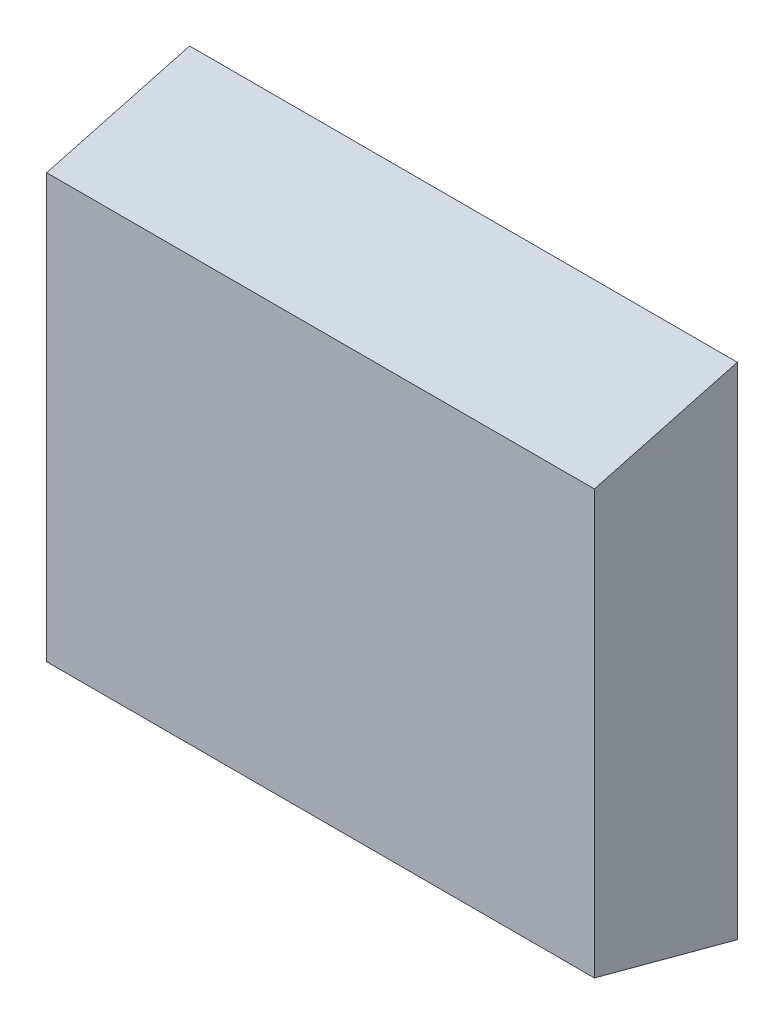
ISO-10303-21;
HEADER;
FILE_DESCRIPTION(('STEP AP214'),'2;1');
FILE_NAME('part.step','',(''),(''),'','','');
FILE_SCHEMA(('AUTOMOTIVE_DESIGN { 1 0 10303 214 1 1 1 1 }'));
ENDSEC;
DATA;
#1=APPLICATION_CONTEXT('core data for automotive mechanical design processes');
#2=APPLICATION_PROTOCOL_DEFINITION('international standard','automotive_design',2000,#1);
#3=PRODUCT_CONTEXT('',#1,'mechanical');
#4=PRODUCT('Part','Part','',(#3));
#5=PRODUCT_RELATED_PRODUCT_CATEGORY('part','',(#4));
#6=PRODUCT_DEFINITION_FORMATION('','',#4);
#7=PRODUCT_DEFINITION_CONTEXT('part definition',#1,'design');
#8=PRODUCT_DEFINITION('design','',#6,#7);
#9=PRODUCT_DEFINITION_SHAPE('','',#8);
#10=(LENGTH_UNIT() NAMED_UNIT(*) SI_UNIT(.MILLI.,.METRE.));
#11=(NAMED_UNIT(*) PLANE_ANGLE_UNIT() SI_UNIT($,.RADIAN.));
#12=(NAMED_UNIT(*) SI_UNIT($,.STERADIAN.) SOLID_ANGLE_UNIT());
#13=UNCERTAINTY_MEASURE_WITH_UNIT(LENGTH_MEASURE(1.E-05),#10,'distance_accuracy_value','');
#14=(GEOMETRIC_REPRESENTATION_CONTEXT(3) GLOBAL_UNCERTAINTY_ASSIGNED_CONTEXT((#13)) GLOBAL_UNIT_ASSIGNED_CONTEXT((#10,
#11,#12)) REPRESENTATION_CONTEXT('',''));
#15=CARTESIAN_POINT('',(0.,0.,0.));
#16=DIRECTION('',(0.,0.,1.));
#17=DIRECTION('',(1.,0.,0.));
#18=AXIS2_PLACEMENT_3D('',#15,#16,#17);
#19=CARTESIAN_POINT('',(17.25,-15.75,9.));
#20=DIRECTION('',(-1.,0.,0.));
#21=DIRECTION('',(0.,0.,1.));
#22=AXIS2_PLACEMENT_3D('',#19,#20,#21);
#23=PLANE('',#22);
#24=DIRECTION('',(0.,1.,0.));
#25=VECTOR('',#24,1.);
#26=CARTESIAN_POINT('',(17.25,-15.75,0.));
#27=LINE('',#26,#25);
#28=CARTESIAN_POINT('',(17.25,-15.75,0.));
#29=VERTEX_POINT('',#28);
#30=CARTESIAN_POINT('',(17.25,15.75,0.));
#31=VERTEX_POINT('',#30);
#32=EDGE_CURVE('E89',#29,#31,#27,.T.);
#33=ORIENTED_EDGE('',*,*,#32,.T.);
#34=DIRECTION('',(0.,0.258819045102519,-0.965925826289069));
#35=VECTOR('',#34,1.);
#36=CARTESIAN_POINT('',(17.25,13.3384572681199,9.));
#37=LINE('',#36,#35);
#38=CARTESIAN_POINT('',(17.25,13.3384572681199,9.));
#39=VERTEX_POINT('',#38);
#40=EDGE_CURVE('E11',#31,#39,#37,.F.);
#41=ORIENTED_EDGE('',*,*,#40,.T.);
#42=DIRECTION('',(0.,1.,0.));
#43=VECTOR('',#42,1.);
#44=CARTESIAN_POINT('',(17.25,-15.75,9.));
#45=LINE('',#44,#43);
#46=CARTESIAN_POINT('',(17.25,-13.3384572681199,9.));
#47=VERTEX_POINT('',#46);
#48=EDGE_CURVE('E119',#47,#39,#45,.T.);
#49=ORIENTED_EDGE('',*,*,#48,.F.);
#50=DIRECTION('',(0.,0.258819045102519,0.965925826289069));
#51=VECTOR('',#50,1.);
#52=CARTESIAN_POINT('',(17.25,-13.3384572681199,9.));
#53=LINE('',#52,#51);
#54=EDGE_CURVE('E51',#47,#29,#53,.F.);
#55=ORIENTED_EDGE('',*,*,#54,.T.);
#56=EDGE_LOOP('',(#33,#41,#49,#55));
#57=FACE_BOUND('',#56,.T.);
#58=ADVANCED_FACE('F41',(#57),#23,.F.);
#59=CARTESIAN_POINT('',(-17.25,-15.75,9.));
#60=DIRECTION('',(1.,0.,0.));
#61=DIRECTION('',(0.,0.,-1.));
#62=AXIS2_PLACEMENT_3D('',#59,#60,#61);
#63=PLANE('',#62);
#64=DIRECTION('',(0.,-1.,0.));
#65=VECTOR('',#64,1.);
#66=CARTESIAN_POINT('',(-17.25,-15.75,9.));
#67=LINE('',#66,#65);
#68=CARTESIAN_POINT('',(-17.25,13.3384572681199,9.));
#69=VERTEX_POINT('',#68);
#70=CARTESIAN_POINT('',(-17.25,-13.3384572681199,9.));
#71=VERTEX_POINT('',#70);
#72=EDGE_CURVE('E110',#69,#71,#67,.T.);
#73=ORIENTED_EDGE('',*,*,#72,.F.);
#74=DIRECTION('',(0.,-0.258819045102519,0.965925826289069));
#75=VECTOR('',#74,1.);
#76=CARTESIAN_POINT('',(-17.25,13.3384572681199,9.));
#77=LINE('',#76,#75);
#78=CARTESIAN_POINT('',(-17.25,15.75,0.));
#79=VERTEX_POINT('',#78);
#80=EDGE_CURVE('E66',#69,#79,#77,.F.);
#81=ORIENTED_EDGE('',*,*,#80,.T.);
#82=DIRECTION('',(0.,-1.,0.));
#83=VECTOR('',#82,1.);
#84=CARTESIAN_POINT('',(-17.25,-15.75,0.));
#85=LINE('',#84,#83);
#86=CARTESIAN_POINT('',(-17.25,-15.75,0.));
#87=VERTEX_POINT('',#86);
#88=EDGE_CURVE('E91',#79,#87,#85,.T.);
#89=ORIENTED_EDGE('',*,*,#88,.T.);
#90=DIRECTION('',(0.,-0.258819045102519,-0.965925826289069));
#91=VECTOR('',#90,1.);
#92=CARTESIAN_POINT('',(-17.25,-13.3384572681199,9.));
#93=LINE('',#92,#91);
#94=EDGE_CURVE('E58',#87,#71,#93,.F.);
#95=ORIENTED_EDGE('',*,*,#94,.T.);
#96=EDGE_LOOP('',(#73,#81,#89,#95));
#97=FACE_BOUND('',#96,.T.);
#98=ADVANCED_FACE('F116',(#97),#63,.F.);
#99=CARTESIAN_POINT('',(0.,0.,9.));
#100=DIRECTION('',(0.,0.,-1.));
#101=DIRECTION('',(-1.,0.,0.));
#102=AXIS2_PLACEMENT_3D('',#99,#100,#101);
#103=PLANE('',#102);
#104=ORIENTED_EDGE('',*,*,#48,.T.);
#105=DIRECTION('',(-1.,0.,0.));
#106=VECTOR('',#105,1.);
#107=CARTESIAN_POINT('',(0.,13.3384572681199,9.));
#108=LINE('',#107,#106);
#109=EDGE_CURVE('E101',#39,#69,#108,.T.);
#110=ORIENTED_EDGE('',*,*,#109,.T.);
#111=ORIENTED_EDGE('',*,*,#72,.T.);
#112=DIRECTION('',(1.,0.,0.));
#113=VECTOR('',#112,1.);
#114=CARTESIAN_POINT('',(0.,-13.3384572681199,9.));
#115=LINE('',#114,#113);
#116=EDGE_CURVE('E104',#71,#47,#115,.T.);
#117=ORIENTED_EDGE('',*,*,#116,.T.);
#118=EDGE_LOOP('',(#104,#110,#111,#117));
#119=FACE_BOUND('',#118,.T.);
#120=ADVANCED_FACE('F128',(#119),#103,.F.);
#121=CARTESIAN_POINT('',(0.,0.,0.));
#122=DIRECTION('',(0.,0.,-1.));
#123=DIRECTION('',(-1.,0.,0.));
#124=AXIS2_PLACEMENT_3D('',#121,#122,#123);
#125=PLANE('',#124);
#126=ORIENTED_EDGE('',*,*,#32,.F.);
#127=DIRECTION('',(1.,0.,0.));
#128=VECTOR('',#127,1.);
#129=CARTESIAN_POINT('',(-17.25,-15.75,0.));
#130=LINE('',#129,#128);
#131=EDGE_CURVE('E122',#87,#29,#130,.T.);
#132=ORIENTED_EDGE('',*,*,#131,.F.);
#133=ORIENTED_EDGE('',*,*,#88,.F.);
#134=DIRECTION('',(-1.,0.,0.));
#135=VECTOR('',#134,1.);
#136=CARTESIAN_POINT('',(-17.25,15.75,0.));
#137=LINE('',#136,#135);
#138=EDGE_CURVE('E85',#31,#79,#137,.T.);
#139=ORIENTED_EDGE('',*,*,#138,.F.);
#140=EDGE_LOOP('',(#126,#132,#133,#139));
#141=FACE_BOUND('',#140,.T.);
#142=ADVANCED_FACE('F87',(#141),#125,.T.);
#143=CARTESIAN_POINT('',(0.,13.3384572681199,9.));
#144=DIRECTION('',(0.,-0.965925826289069,-0.258819045102519));
#145=DIRECTION('',(-1.,0.,0.));
#146=AXIS2_PLACEMENT_3D('',#143,#144,#145);
#147=PLANE('',#146);
#148=ORIENTED_EDGE('',*,*,#40,.F.);
#149=ORIENTED_EDGE('',*,*,#138,.T.);
#150=ORIENTED_EDGE('',*,*,#80,.F.);
#151=ORIENTED_EDGE('',*,*,#109,.F.);
#152=EDGE_LOOP('',(#148,#149,#150,#151));
#153=FACE_BOUND('',#152,.T.);
#154=ADVANCED_FACE('F100',(#153),#147,.F.);
#155=CARTESIAN_POINT('',(0.,-13.3384572681199,9.));
#156=DIRECTION('',(0.,0.965925826289069,-0.258819045102519));
#157=DIRECTION('',(1.,0.,0.));
#158=AXIS2_PLACEMENT_3D('',#155,#156,#157);
#159=PLANE('',#158);
#160=ORIENTED_EDGE('',*,*,#94,.F.);
#161=ORIENTED_EDGE('',*,*,#131,.T.);
#162=ORIENTED_EDGE('',*,*,#54,.F.);
#163=ORIENTED_EDGE('',*,*,#116,.F.);
#164=EDGE_LOOP('',(#160,#161,#162,#163));
#165=FACE_BOUND('',#164,.T.);
#166=ADVANCED_FACE('F44',(#165),#159,.F.);
#167=CLOSED_SHELL('',(#58,#98,#120,#142,#154,#166));
#168=MANIFOLD_SOLID_BREP('B2',#167);
#169=ADVANCED_BREP_SHAPE_REPRESENTATION('',(#18,#168),#14);
#170=SHAPE_DEFINITION_REPRESENTATION(#9,#169);
ENDSEC;
END-ISO-10303-21;
